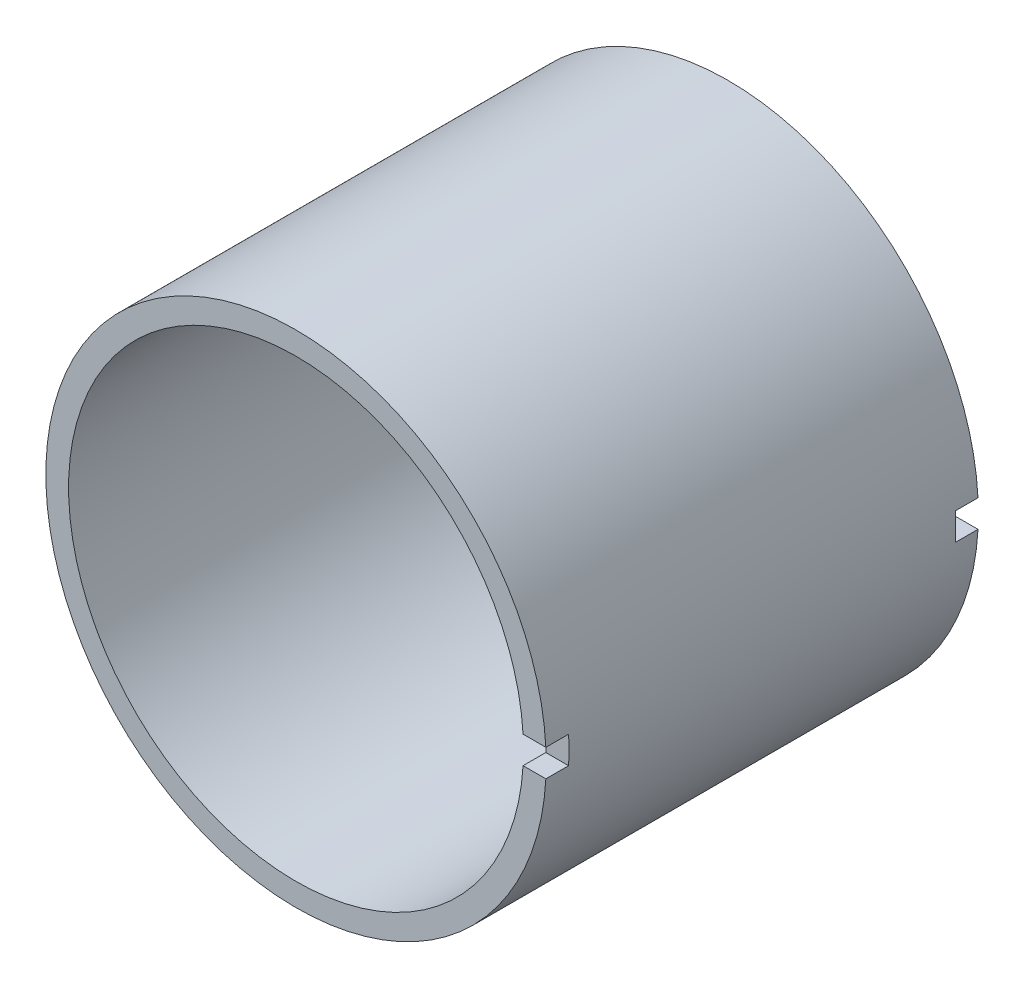
ISO-10303-21;
HEADER;
FILE_DESCRIPTION(('STEP AP214'),'2;1');
FILE_NAME('part.step','',(''),(''),'','','');
FILE_SCHEMA(('AUTOMOTIVE_DESIGN { 1 0 10303 214 1 1 1 1 }'));
ENDSEC;
DATA;
#1=APPLICATION_CONTEXT('core data for automotive mechanical design processes');
#2=APPLICATION_PROTOCOL_DEFINITION('international standard','automotive_design',2000,#1);
#3=PRODUCT_CONTEXT('',#1,'mechanical');
#4=PRODUCT('Part','Part','',(#3));
#5=PRODUCT_RELATED_PRODUCT_CATEGORY('part','',(#4));
#6=PRODUCT_DEFINITION_FORMATION('','',#4);
#7=PRODUCT_DEFINITION_CONTEXT('part definition',#1,'design');
#8=PRODUCT_DEFINITION('design','',#6,#7);
#9=PRODUCT_DEFINITION_SHAPE('','',#8);
#10=(LENGTH_UNIT() NAMED_UNIT(*) SI_UNIT(.MILLI.,.METRE.));
#11=(NAMED_UNIT(*) PLANE_ANGLE_UNIT() SI_UNIT($,.RADIAN.));
#12=(NAMED_UNIT(*) SI_UNIT($,.STERADIAN.) SOLID_ANGLE_UNIT());
#13=UNCERTAINTY_MEASURE_WITH_UNIT(LENGTH_MEASURE(1.E-05),#10,'distance_accuracy_value','');
#14=(GEOMETRIC_REPRESENTATION_CONTEXT(3) GLOBAL_UNCERTAINTY_ASSIGNED_CONTEXT((#13)) GLOBAL_UNIT_ASSIGNED_CONTEXT((#10,
#11,#12)) REPRESENTATION_CONTEXT('',''));
#15=CARTESIAN_POINT('',(0.,0.,0.));
#16=DIRECTION('',(0.,0.,1.));
#17=DIRECTION('',(1.,0.,0.));
#18=AXIS2_PLACEMENT_3D('',#15,#16,#17);
#19=CARTESIAN_POINT('',(-0.0195470693560484,0.0021960919807713,81.7922710574948));
#20=DIRECTION('',(0.,0.,1.));
#21=DIRECTION('',(0.,-1.,0.));
#22=AXIS2_PLACEMENT_3D('',#19,#20,#21);
#23=PLANE('',#22);
#24=DIRECTION('',(1.,0.,0.));
#25=VECTOR('',#24,1.);
#26=CARTESIAN_POINT('',(49.890371784515,-2.99780390801929,81.7922710574948));
#27=LINE('',#26,#25);
#28=CARTESIAN_POINT('',(49.890371784515,-2.99780390801929,81.7922710574948));
#29=VERTEX_POINT('',#28);
#30=CARTESIAN_POINT('',(54.8985738016278,-2.99780390801929,81.7922710574948));
#31=VERTEX_POINT('',#30);
#32=EDGE_CURVE('E11',#29,#31,#27,.T.);
#33=ORIENTED_EDGE('',*,*,#32,.T.);
#34=CARTESIAN_POINT('',(-0.0195470693560484,0.0021960919807713,81.7922710574948));
#35=DIRECTION('',(0.,0.,-1.));
#36=DIRECTION('',(0.,-1.,0.));
#37=AXIS2_PLACEMENT_3D('',#34,#35,#36);
#38=CIRCLE('',#37,55.);
#39=CARTESIAN_POINT('',(54.8985738016297,3.00219609194753,81.7922710574948));
#40=VERTEX_POINT('',#39);
#41=EDGE_CURVE('E27',#31,#40,#38,.T.);
#42=ORIENTED_EDGE('',*,*,#41,.T.);
#43=DIRECTION('',(-1.,0.,0.));
#44=VECTOR('',#43,1.);
#45=CARTESIAN_POINT('',(54.8985738016298,3.00219609198071,81.7922710574948));
#46=LINE('',#45,#44);
#47=CARTESIAN_POINT('',(49.890371784515,3.00219609198073,81.7922710574948));
#48=VERTEX_POINT('',#47);
#49=EDGE_CURVE('E86',#40,#48,#46,.T.);
#50=ORIENTED_EDGE('',*,*,#49,.T.);
#51=CARTESIAN_POINT('',(-0.0195470693560484,0.0021960919807713,81.7922710574948));
#52=DIRECTION('',(0.,0.,-1.));
#53=DIRECTION('',(0.,-1.,0.));
#54=AXIS2_PLACEMENT_3D('',#51,#52,#53);
#55=CIRCLE('',#54,50.);
#56=EDGE_CURVE('E114',#29,#48,#55,.T.);
#57=ORIENTED_EDGE('',*,*,#56,.F.);
#58=EDGE_LOOP('',(#33,#42,#50,#57));
#59=FACE_BOUND('',#58,.T.);
#60=ADVANCED_FACE('F17',(#59),#23,.F.);
#61=CARTESIAN_POINT('',(-0.0195470693560484,0.0021960919807713,81.7922710574948));
#62=DIRECTION('',(0.,0.,1.));
#63=DIRECTION('',(0.,-1.,0.));
#64=AXIS2_PLACEMENT_3D('',#61,#62,#63);
#65=CYLINDRICAL_SURFACE('',#64,50.);
#66=DIRECTION('',(0.,0.,1.));
#67=VECTOR('',#66,1.);
#68=CARTESIAN_POINT('',(49.890371784515,-2.99780390801929,171.792271057495));
#69=LINE('',#68,#67);
#70=CARTESIAN_POINT('',(49.890371784515,-2.99780390801929,171.792271057495));
#71=VERTEX_POINT('',#70);
#72=CARTESIAN_POINT('',(49.890371784515,-2.99780390801929,176.792271057495));
#73=VERTEX_POINT('',#72);
#74=EDGE_CURVE('E123',#71,#73,#69,.T.);
#75=ORIENTED_EDGE('',*,*,#74,.F.);
#76=CARTESIAN_POINT('',(-0.0195470693560484,0.0021960919807713,171.792271057495));
#77=DIRECTION('',(0.,0.,-1.));
#78=DIRECTION('',(0.,-1.,0.));
#79=AXIS2_PLACEMENT_3D('',#76,#77,#78);
#80=CIRCLE('',#79,50.);
#81=CARTESIAN_POINT('',(49.890371784515,3.00219609198071,171.792271057495));
#82=VERTEX_POINT('',#81);
#83=EDGE_CURVE('E129',#82,#71,#80,.T.);
#84=ORIENTED_EDGE('',*,*,#83,.F.);
#85=DIRECTION('',(0.,0.,1.));
#86=VECTOR('',#85,1.);
#87=CARTESIAN_POINT('',(49.890371784515,3.00219609198071,171.792271057495));
#88=LINE('',#87,#86);
#89=CARTESIAN_POINT('',(49.890371784515,3.00219609198071,176.792271057495));
#90=VERTEX_POINT('',#89);
#91=EDGE_CURVE('E137',#82,#90,#88,.T.);
#92=ORIENTED_EDGE('',*,*,#91,.T.);
#93=CARTESIAN_POINT('',(-0.0195470693560484,0.0021960919807713,176.792271057495));
#94=DIRECTION('',(0.,0.,-1.));
#95=DIRECTION('',(0.,-1.,0.));
#96=AXIS2_PLACEMENT_3D('',#93,#94,#95);
#97=CIRCLE('',#96,50.);
#98=EDGE_CURVE('E88',#73,#90,#97,.T.);
#99=ORIENTED_EDGE('',*,*,#98,.F.);
#100=EDGE_LOOP('',(#75,#84,#92,#99));
#101=FACE_BOUND('',#100,.T.);
#102=CARTESIAN_POINT('',(-0.0195470693560484,0.0021960919807713,86.7922710574948));
#103=DIRECTION('',(0.,0.,-1.));
#104=DIRECTION('',(0.,-1.,0.));
#105=AXIS2_PLACEMENT_3D('',#102,#103,#104);
#106=CIRCLE('',#105,50.);
#107=CARTESIAN_POINT('',(49.890371784515,3.00219609198073,86.7922710574948));
#108=VERTEX_POINT('',#107);
#109=CARTESIAN_POINT('',(49.890371784515,-2.99780390801929,86.7922710574948));
#110=VERTEX_POINT('',#109);
#111=EDGE_CURVE('E98',#108,#110,#106,.T.);
#112=ORIENTED_EDGE('',*,*,#111,.T.);
#113=DIRECTION('',(0.,0.,-1.));
#114=VECTOR('',#113,1.);
#115=CARTESIAN_POINT('',(49.890371784515,-2.99780390801929,86.7922710574948));
#116=LINE('',#115,#114);
#117=EDGE_CURVE('E105',#110,#29,#116,.T.);
#118=ORIENTED_EDGE('',*,*,#117,.T.);
#119=ORIENTED_EDGE('',*,*,#56,.T.);
#120=DIRECTION('',(0.,0.,-1.));
#121=VECTOR('',#120,1.);
#122=CARTESIAN_POINT('',(49.890371784515,3.00219609198073,86.7922710574948));
#123=LINE('',#122,#121);
#124=EDGE_CURVE('E99',#108,#48,#123,.T.);
#125=ORIENTED_EDGE('',*,*,#124,.F.);
#126=EDGE_LOOP('',(#112,#118,#119,#125));
#127=FACE_BOUND('',#126,.T.);
#128=ADVANCED_FACE('F159',(#101,#127),#65,.F.);
#129=CARTESIAN_POINT('',(-0.0195470693560484,0.0021960919807713,81.7922710574948));
#130=DIRECTION('',(0.,0.,1.));
#131=DIRECTION('',(0.,-1.,0.));
#132=AXIS2_PLACEMENT_3D('',#129,#130,#131);
#133=CYLINDRICAL_SURFACE('',#132,55.);
#134=CARTESIAN_POINT('',(-0.0195470693560484,0.0021960919807713,171.792271057495));
#135=DIRECTION('',(0.,0.,1.));
#136=DIRECTION('',(0.,-1.,0.));
#137=AXIS2_PLACEMENT_3D('',#134,#135,#136);
#138=CIRCLE('',#137,55.);
#139=CARTESIAN_POINT('',(54.8985738016278,-2.99780390801929,171.792271057495));
#140=VERTEX_POINT('',#139);
#141=CARTESIAN_POINT('',(54.8985738016297,3.00219609194753,171.792271057495));
#142=VERTEX_POINT('',#141);
#143=EDGE_CURVE('E107',#140,#142,#138,.T.);
#144=ORIENTED_EDGE('',*,*,#143,.F.);
#145=DIRECTION('',(0.,0.,1.));
#146=VECTOR('',#145,1.);
#147=CARTESIAN_POINT('',(54.8985738016278,-2.99780390801929,171.792271057495));
#148=LINE('',#147,#146);
#149=CARTESIAN_POINT('',(54.8985738016278,-2.99780390801929,176.792271057495));
#150=VERTEX_POINT('',#149);
#151=EDGE_CURVE('E111',#140,#150,#148,.T.);
#152=ORIENTED_EDGE('',*,*,#151,.T.);
#153=CARTESIAN_POINT('',(-0.0195470693560484,0.0021960919807713,176.792271057495));
#154=DIRECTION('',(0.,0.,-1.));
#155=DIRECTION('',(0.,-1.,0.));
#156=AXIS2_PLACEMENT_3D('',#153,#154,#155);
#157=CIRCLE('',#156,55.);
#158=CARTESIAN_POINT('',(54.8985738016297,3.00219609194753,176.792271057495));
#159=VERTEX_POINT('',#158);
#160=EDGE_CURVE('E94',#150,#159,#157,.T.);
#161=ORIENTED_EDGE('',*,*,#160,.T.);
#162=DIRECTION('',(0.,0.,1.));
#163=VECTOR('',#162,1.);
#164=CARTESIAN_POINT('',(54.8985738016297,3.00219609194753,171.792271057495));
#165=LINE('',#164,#163);
#166=EDGE_CURVE('E117',#142,#159,#165,.T.);
#167=ORIENTED_EDGE('',*,*,#166,.F.);
#168=EDGE_LOOP('',(#144,#152,#161,#167));
#169=FACE_BOUND('',#168,.T.);
#170=DIRECTION('',(0.,0.,-1.));
#171=VECTOR('',#170,1.);
#172=CARTESIAN_POINT('',(54.8985738016278,-2.99780390801929,86.7922710574948));
#173=LINE('',#172,#171);
#174=CARTESIAN_POINT('',(54.8985738016278,-2.99780390801929,86.7922710574948));
#175=VERTEX_POINT('',#174);
#176=EDGE_CURVE('E76',#175,#31,#173,.T.);
#177=ORIENTED_EDGE('',*,*,#176,.F.);
#178=CARTESIAN_POINT('',(-0.0195470693560484,0.0021960919807713,86.7922710574948));
#179=DIRECTION('',(0.,0.,1.));
#180=DIRECTION('',(0.,-1.,0.));
#181=AXIS2_PLACEMENT_3D('',#178,#179,#180);
#182=CIRCLE('',#181,55.);
#183=CARTESIAN_POINT('',(54.8985738016297,3.00219609194753,86.7922710574948));
#184=VERTEX_POINT('',#183);
#185=EDGE_CURVE('E87',#175,#184,#182,.T.);
#186=ORIENTED_EDGE('',*,*,#185,.T.);
#187=DIRECTION('',(0.,0.,-1.));
#188=VECTOR('',#187,1.);
#189=CARTESIAN_POINT('',(54.8985738016297,3.00219609194753,86.7922710574948));
#190=LINE('',#189,#188);
#191=EDGE_CURVE('E81',#184,#40,#190,.T.);
#192=ORIENTED_EDGE('',*,*,#191,.T.);
#193=ORIENTED_EDGE('',*,*,#41,.F.);
#194=EDGE_LOOP('',(#177,#186,#192,#193));
#195=FACE_BOUND('',#194,.T.);
#196=ADVANCED_FACE('F90',(#169,#195),#133,.T.);
#197=CARTESIAN_POINT('',(-0.0195470693560484,0.0021960919807713,176.792271057495));
#198=DIRECTION('',(0.,0.,1.));
#199=DIRECTION('',(0.,-1.,0.));
#200=AXIS2_PLACEMENT_3D('',#197,#198,#199);
#201=PLANE('',#200);
#202=ORIENTED_EDGE('',*,*,#160,.F.);
#203=DIRECTION('',(1.,0.,0.));
#204=VECTOR('',#203,1.);
#205=CARTESIAN_POINT('',(49.890371784515,-2.99780390801929,176.792271057495));
#206=LINE('',#205,#204);
#207=EDGE_CURVE('E120',#73,#150,#206,.T.);
#208=ORIENTED_EDGE('',*,*,#207,.F.);
#209=ORIENTED_EDGE('',*,*,#98,.T.);
#210=DIRECTION('',(-1.,0.,0.));
#211=VECTOR('',#210,1.);
#212=CARTESIAN_POINT('',(54.8985738016278,3.00219609198071,176.792271057495));
#213=LINE('',#212,#211);
#214=EDGE_CURVE('E118',#159,#90,#213,.T.);
#215=ORIENTED_EDGE('',*,*,#214,.F.);
#216=EDGE_LOOP('',(#202,#208,#209,#215));
#217=FACE_BOUND('',#216,.T.);
#218=ADVANCED_FACE('F169',(#217),#201,.T.);
#219=CARTESIAN_POINT('',(49.890371784515,-2.99780390801929,171.792271057495));
#220=DIRECTION('',(0.,-1.,0.));
#221=DIRECTION('',(1.,0.,0.));
#222=AXIS2_PLACEMENT_3D('',#219,#220,#221);
#223=PLANE('',#222);
#224=ORIENTED_EDGE('',*,*,#207,.T.);
#225=ORIENTED_EDGE('',*,*,#151,.F.);
#226=DIRECTION('',(1.,0.,0.));
#227=VECTOR('',#226,1.);
#228=CARTESIAN_POINT('',(49.890371784515,-2.99780390801929,171.792271057495));
#229=LINE('',#228,#227);
#230=EDGE_CURVE('E109',#71,#140,#229,.T.);
#231=ORIENTED_EDGE('',*,*,#230,.F.);
#232=ORIENTED_EDGE('',*,*,#74,.T.);
#233=EDGE_LOOP('',(#224,#225,#231,#232));
#234=FACE_BOUND('',#233,.T.);
#235=ADVANCED_FACE('F173',(#234),#223,.F.);
#236=CARTESIAN_POINT('',(54.8985738016278,3.00219609198071,171.792271057495));
#237=DIRECTION('',(0.,1.,0.));
#238=DIRECTION('',(-1.,0.,0.));
#239=AXIS2_PLACEMENT_3D('',#236,#237,#238);
#240=PLANE('',#239);
#241=ORIENTED_EDGE('',*,*,#214,.T.);
#242=ORIENTED_EDGE('',*,*,#91,.F.);
#243=DIRECTION('',(-1.,0.,0.));
#244=VECTOR('',#243,1.);
#245=CARTESIAN_POINT('',(54.8985738016278,3.00219609198071,171.792271057495));
#246=LINE('',#245,#244);
#247=EDGE_CURVE('E110',#142,#82,#246,.T.);
#248=ORIENTED_EDGE('',*,*,#247,.F.);
#249=ORIENTED_EDGE('',*,*,#166,.T.);
#250=EDGE_LOOP('',(#241,#242,#248,#249));
#251=FACE_BOUND('',#250,.T.);
#252=ADVANCED_FACE('F156',(#251),#240,.F.);
#253=CARTESIAN_POINT('',(-0.0195470693560484,0.0021960919807713,171.792271057495));
#254=DIRECTION('',(0.,0.,1.));
#255=DIRECTION('',(0.,-1.,0.));
#256=AXIS2_PLACEMENT_3D('',#253,#254,#255);
#257=PLANE('',#256);
#258=ORIENTED_EDGE('',*,*,#230,.T.);
#259=ORIENTED_EDGE('',*,*,#143,.T.);
#260=ORIENTED_EDGE('',*,*,#247,.T.);
#261=ORIENTED_EDGE('',*,*,#83,.T.);
#262=EDGE_LOOP('',(#258,#259,#260,#261));
#263=FACE_BOUND('',#262,.T.);
#264=ADVANCED_FACE('F149',(#263),#257,.T.);
#265=CARTESIAN_POINT('',(49.890371784515,-2.99780390801929,86.7922710574948));
#266=DIRECTION('',(0.,1.,0.));
#267=DIRECTION('',(-1.,0.,0.));
#268=AXIS2_PLACEMENT_3D('',#265,#266,#267);
#269=PLANE('',#268);
#270=ORIENTED_EDGE('',*,*,#32,.F.);
#271=ORIENTED_EDGE('',*,*,#117,.F.);
#272=DIRECTION('',(1.,0.,0.));
#273=VECTOR('',#272,1.);
#274=CARTESIAN_POINT('',(49.890371784515,-2.99780390801929,86.7922710574948));
#275=LINE('',#274,#273);
#276=EDGE_CURVE('E100',#110,#175,#275,.T.);
#277=ORIENTED_EDGE('',*,*,#276,.T.);
#278=ORIENTED_EDGE('',*,*,#176,.T.);
#279=EDGE_LOOP('',(#270,#271,#277,#278));
#280=FACE_BOUND('',#279,.T.);
#281=ADVANCED_FACE('F147',(#280),#269,.T.);
#282=CARTESIAN_POINT('',(54.8985738016298,3.00219609198071,86.7922710574948));
#283=DIRECTION('',(0.,-1.,0.));
#284=DIRECTION('',(1.,0.,0.));
#285=AXIS2_PLACEMENT_3D('',#282,#283,#284);
#286=PLANE('',#285);
#287=ORIENTED_EDGE('',*,*,#49,.F.);
#288=ORIENTED_EDGE('',*,*,#191,.F.);
#289=DIRECTION('',(-1.,0.,0.));
#290=VECTOR('',#289,1.);
#291=CARTESIAN_POINT('',(54.8985738016298,3.00219609198071,86.7922710574948));
#292=LINE('',#291,#290);
#293=EDGE_CURVE('E21',#184,#108,#292,.T.);
#294=ORIENTED_EDGE('',*,*,#293,.T.);
#295=ORIENTED_EDGE('',*,*,#124,.T.);
#296=EDGE_LOOP('',(#287,#288,#294,#295));
#297=FACE_BOUND('',#296,.T.);
#298=ADVANCED_FACE('F82',(#297),#286,.T.);
#299=CARTESIAN_POINT('',(-0.0195470693560484,0.0021960919807713,86.7922710574948));
#300=DIRECTION('',(0.,0.,-1.));
#301=DIRECTION('',(0.,1.,0.));
#302=AXIS2_PLACEMENT_3D('',#299,#300,#301);
#303=PLANE('',#302);
#304=ORIENTED_EDGE('',*,*,#111,.F.);
#305=ORIENTED_EDGE('',*,*,#293,.F.);
#306=ORIENTED_EDGE('',*,*,#185,.F.);
#307=ORIENTED_EDGE('',*,*,#276,.F.);
#308=EDGE_LOOP('',(#304,#305,#306,#307));
#309=FACE_BOUND('',#308,.T.);
#310=ADVANCED_FACE('F19',(#309),#303,.T.);
#311=CLOSED_SHELL('',(#60,#128,#196,#218,#235,#252,#264,#281,#298,#310));
#312=MANIFOLD_SOLID_BREP('B1',#311);
#313=ADVANCED_BREP_SHAPE_REPRESENTATION('',(#18,#312),#14);
#314=SHAPE_DEFINITION_REPRESENTATION(#9,#313);
ENDSEC;
END-ISO-10303-21;
